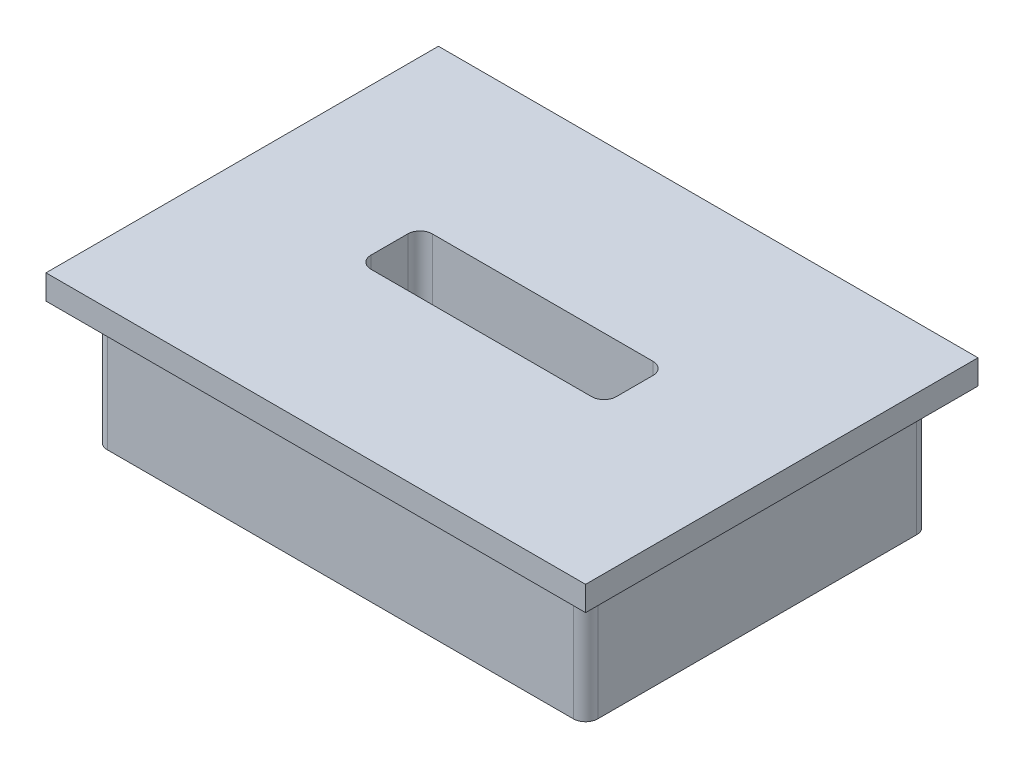
ISO-10303-21;
HEADER;
FILE_DESCRIPTION(('STEP AP214'),'2;1');
FILE_NAME('part.step','',(''),(''),'','','');
FILE_SCHEMA(('AUTOMOTIVE_DESIGN { 1 0 10303 214 1 1 1 1 }'));
ENDSEC;
DATA;
#1=APPLICATION_CONTEXT('core data for automotive mechanical design processes');
#2=APPLICATION_PROTOCOL_DEFINITION('international standard','automotive_design',2000,#1);
#3=PRODUCT_CONTEXT('',#1,'mechanical');
#4=PRODUCT('Part','Part','',(#3));
#5=PRODUCT_RELATED_PRODUCT_CATEGORY('part','',(#4));
#6=PRODUCT_DEFINITION_FORMATION('','',#4);
#7=PRODUCT_DEFINITION_CONTEXT('part definition',#1,'design');
#8=PRODUCT_DEFINITION('design','',#6,#7);
#9=PRODUCT_DEFINITION_SHAPE('','',#8);
#10=(LENGTH_UNIT() NAMED_UNIT(*) SI_UNIT(.MILLI.,.METRE.));
#11=(NAMED_UNIT(*) PLANE_ANGLE_UNIT() SI_UNIT($,.RADIAN.));
#12=(NAMED_UNIT(*) SI_UNIT($,.STERADIAN.) SOLID_ANGLE_UNIT());
#13=UNCERTAINTY_MEASURE_WITH_UNIT(LENGTH_MEASURE(1.E-05),#10,'distance_accuracy_value','');
#14=(GEOMETRIC_REPRESENTATION_CONTEXT(3) GLOBAL_UNCERTAINTY_ASSIGNED_CONTEXT((#13)) GLOBAL_UNIT_ASSIGNED_CONTEXT((#10,
#11,#12)) REPRESENTATION_CONTEXT('',''));
#15=CARTESIAN_POINT('',(0.,0.,0.));
#16=DIRECTION('',(0.,0.,1.));
#17=DIRECTION('',(1.,0.,0.));
#18=AXIS2_PLACEMENT_3D('',#15,#16,#17);
#19=CARTESIAN_POINT('',(0.,0.,0.));
#20=DIRECTION('',(0.,1.,0.));
#21=DIRECTION('',(0.,0.,1.));
#22=AXIS2_PLACEMENT_3D('',#19,#20,#21);
#23=PLANE('',#22);
#24=DIRECTION('',(-1.,0.,0.));
#25=VECTOR('',#24,1.);
#26=CARTESIAN_POINT('',(0.,0.,0.));
#27=LINE('',#26,#25);
#28=CARTESIAN_POINT('',(19.5,0.,0.));
#29=VERTEX_POINT('',#28);
#30=CARTESIAN_POINT('',(0.5,0.,0.));
#31=VERTEX_POINT('',#30);
#32=EDGE_CURVE('E239',#29,#31,#27,.T.);
#33=ORIENTED_EDGE('',*,*,#32,.F.);
#34=CARTESIAN_POINT('',(19.5,0.,0.5));
#35=DIRECTION('',(0.,1.,0.));
#36=DIRECTION('',(0.,0.,1.));
#37=AXIS2_PLACEMENT_3D('',#34,#35,#36);
#38=CIRCLE('',#37,0.5);
#39=CARTESIAN_POINT('',(20.,0.,0.5));
#40=VERTEX_POINT('',#39);
#41=EDGE_CURVE('E307',#29,#40,#38,.F.);
#42=ORIENTED_EDGE('',*,*,#41,.T.);
#43=DIRECTION('',(0.,0.,-1.));
#44=VECTOR('',#43,1.);
#45=CARTESIAN_POINT('',(20.,0.,0.));
#46=LINE('',#45,#44);
#47=CARTESIAN_POINT('',(20.,0.,13.5));
#48=VERTEX_POINT('',#47);
#49=EDGE_CURVE('E257',#48,#40,#46,.T.);
#50=ORIENTED_EDGE('',*,*,#49,.F.);
#51=CARTESIAN_POINT('',(19.5,0.,13.5));
#52=DIRECTION('',(0.,1.,0.));
#53=DIRECTION('',(0.,0.,1.));
#54=AXIS2_PLACEMENT_3D('',#51,#52,#53);
#55=CIRCLE('',#54,0.5);
#56=CARTESIAN_POINT('',(19.5,0.,14.));
#57=VERTEX_POINT('',#56);
#58=EDGE_CURVE('E298',#48,#57,#55,.F.);
#59=ORIENTED_EDGE('',*,*,#58,.T.);
#60=DIRECTION('',(1.,0.,0.));
#61=VECTOR('',#60,1.);
#62=CARTESIAN_POINT('',(0.,0.,14.));
#63=LINE('',#62,#61);
#64=CARTESIAN_POINT('',(0.500000000000002,0.,14.));
#65=VERTEX_POINT('',#64);
#66=EDGE_CURVE('E254',#65,#57,#63,.T.);
#67=ORIENTED_EDGE('',*,*,#66,.F.);
#68=CARTESIAN_POINT('',(0.500000000000002,0.,13.5));
#69=DIRECTION('',(0.,1.,0.));
#70=DIRECTION('',(0.,0.,1.));
#71=AXIS2_PLACEMENT_3D('',#68,#69,#70);
#72=CIRCLE('',#71,0.5);
#73=CARTESIAN_POINT('',(0.,0.,13.5));
#74=VERTEX_POINT('',#73);
#75=EDGE_CURVE('E301',#65,#74,#72,.F.);
#76=ORIENTED_EDGE('',*,*,#75,.T.);
#77=DIRECTION('',(0.,0.,1.));
#78=VECTOR('',#77,1.);
#79=CARTESIAN_POINT('',(0.,0.,0.));
#80=LINE('',#79,#78);
#81=CARTESIAN_POINT('',(0.,0.,0.5));
#82=VERTEX_POINT('',#81);
#83=EDGE_CURVE('E234',#82,#74,#80,.T.);
#84=ORIENTED_EDGE('',*,*,#83,.F.);
#85=CARTESIAN_POINT('',(0.5,0.,0.5));
#86=DIRECTION('',(0.,1.,0.));
#87=DIRECTION('',(0.,0.,1.));
#88=AXIS2_PLACEMENT_3D('',#85,#86,#87);
#89=CIRCLE('',#88,0.5);
#90=EDGE_CURVE('E304',#82,#31,#89,.F.);
#91=ORIENTED_EDGE('',*,*,#90,.T.);
#92=EDGE_LOOP('',(#33,#42,#50,#59,#67,#76,#84,#91));
#93=FACE_BOUND('',#92,.T.);
#94=DIRECTION('',(1.,0.,0.));
#95=VECTOR('',#94,1.);
#96=CARTESIAN_POINT('',(5.,0.,8.25));
#97=LINE('',#96,#95);
#98=CARTESIAN_POINT('',(5.5,0.,8.25));
#99=VERTEX_POINT('',#98);
#100=CARTESIAN_POINT('',(14.5,0.,8.25));
#101=VERTEX_POINT('',#100);
#102=EDGE_CURVE('E230',#99,#101,#97,.T.);
#103=ORIENTED_EDGE('',*,*,#102,.T.);
#104=CARTESIAN_POINT('',(14.5,0.,7.75));
#105=DIRECTION('',(0.,1.,0.));
#106=DIRECTION('',(0.,0.,1.));
#107=AXIS2_PLACEMENT_3D('',#104,#105,#106);
#108=CIRCLE('',#107,0.5);
#109=CARTESIAN_POINT('',(15.,0.,7.75));
#110=VERTEX_POINT('',#109);
#111=EDGE_CURVE('E348',#101,#110,#108,.T.);
#112=ORIENTED_EDGE('',*,*,#111,.T.);
#113=DIRECTION('',(0.,0.,-1.));
#114=VECTOR('',#113,1.);
#115=CARTESIAN_POINT('',(15.,0.,5.75));
#116=LINE('',#115,#114);
#117=CARTESIAN_POINT('',(15.,0.,6.25));
#118=VERTEX_POINT('',#117);
#119=EDGE_CURVE('E212',#110,#118,#116,.T.);
#120=ORIENTED_EDGE('',*,*,#119,.T.);
#121=CARTESIAN_POINT('',(14.5,0.,6.25));
#122=DIRECTION('',(0.,1.,0.));
#123=DIRECTION('',(0.,0.,1.));
#124=AXIS2_PLACEMENT_3D('',#121,#122,#123);
#125=CIRCLE('',#124,0.5);
#126=CARTESIAN_POINT('',(14.5,0.,5.75));
#127=VERTEX_POINT('',#126);
#128=EDGE_CURVE('E336',#118,#127,#125,.T.);
#129=ORIENTED_EDGE('',*,*,#128,.T.);
#130=DIRECTION('',(-1.,0.,0.));
#131=VECTOR('',#130,1.);
#132=CARTESIAN_POINT('',(5.,0.,5.75));
#133=LINE('',#132,#131);
#134=CARTESIAN_POINT('',(5.5,0.,5.75));
#135=VERTEX_POINT('',#134);
#136=EDGE_CURVE('E217',#127,#135,#133,.T.);
#137=ORIENTED_EDGE('',*,*,#136,.T.);
#138=CARTESIAN_POINT('',(5.5,0.,6.25));
#139=DIRECTION('',(0.,1.,0.));
#140=DIRECTION('',(0.,0.,1.));
#141=AXIS2_PLACEMENT_3D('',#138,#139,#140);
#142=CIRCLE('',#141,0.5);
#143=CARTESIAN_POINT('',(5.,0.,6.25));
#144=VERTEX_POINT('',#143);
#145=EDGE_CURVE('E330',#135,#144,#142,.T.);
#146=ORIENTED_EDGE('',*,*,#145,.T.);
#147=DIRECTION('',(0.,0.,1.));
#148=VECTOR('',#147,1.);
#149=CARTESIAN_POINT('',(5.,0.,5.75));
#150=LINE('',#149,#148);
#151=CARTESIAN_POINT('',(5.,0.,7.75));
#152=VERTEX_POINT('',#151);
#153=EDGE_CURVE('E226',#144,#152,#150,.T.);
#154=ORIENTED_EDGE('',*,*,#153,.T.);
#155=CARTESIAN_POINT('',(5.5,0.,7.75));
#156=DIRECTION('',(0.,1.,0.));
#157=DIRECTION('',(0.,0.,1.));
#158=AXIS2_PLACEMENT_3D('',#155,#156,#157);
#159=CIRCLE('',#158,0.5);
#160=EDGE_CURVE('E342',#152,#99,#159,.T.);
#161=ORIENTED_EDGE('',*,*,#160,.T.);
#162=EDGE_LOOP('',(#103,#112,#120,#129,#137,#146,#154,#161));
#163=FACE_BOUND('',#162,.T.);
#164=ADVANCED_FACE('F45',(#93,#163),#23,.F.);
#165=CARTESIAN_POINT('',(0.,5.,0.));
#166=DIRECTION('',(1.,0.,0.));
#167=DIRECTION('',(0.,0.,-1.));
#168=AXIS2_PLACEMENT_3D('',#165,#166,#167);
#169=PLANE('',#168);
#170=DIRECTION('',(0.,0.,1.));
#171=VECTOR('',#170,1.);
#172=CARTESIAN_POINT('',(0.,5.,0.));
#173=LINE('',#172,#171);
#174=CARTESIAN_POINT('',(0.,5.,0.5));
#175=VERTEX_POINT('',#174);
#176=CARTESIAN_POINT('',(0.,5.,13.5));
#177=VERTEX_POINT('',#176);
#178=EDGE_CURVE('E235',#175,#177,#173,.T.);
#179=ORIENTED_EDGE('',*,*,#178,.F.);
#180=DIRECTION('',(0.,-1.,0.));
#181=VECTOR('',#180,1.);
#182=CARTESIAN_POINT('',(0.,5.,0.5));
#183=LINE('',#182,#181);
#184=EDGE_CURVE('E320',#175,#82,#183,.T.);
#185=ORIENTED_EDGE('',*,*,#184,.T.);
#186=ORIENTED_EDGE('',*,*,#83,.T.);
#187=DIRECTION('',(0.,-1.,0.));
#188=VECTOR('',#187,1.);
#189=CARTESIAN_POINT('',(0.,5.,13.5));
#190=LINE('',#189,#188);
#191=EDGE_CURVE('E317',#74,#177,#190,.F.);
#192=ORIENTED_EDGE('',*,*,#191,.T.);
#193=EDGE_LOOP('',(#179,#185,#186,#192));
#194=FACE_BOUND('',#193,.T.);
#195=ADVANCED_FACE('F368',(#194),#169,.F.);
#196=CARTESIAN_POINT('',(0.,5.,14.));
#197=DIRECTION('',(0.,0.,-1.));
#198=DIRECTION('',(-1.,0.,0.));
#199=AXIS2_PLACEMENT_3D('',#196,#197,#198);
#200=PLANE('',#199);
#201=DIRECTION('',(1.,0.,0.));
#202=VECTOR('',#201,1.);
#203=CARTESIAN_POINT('',(0.,5.,14.));
#204=LINE('',#203,#202);
#205=CARTESIAN_POINT('',(0.500000000000002,5.,14.));
#206=VERTEX_POINT('',#205);
#207=CARTESIAN_POINT('',(19.5,5.,14.));
#208=VERTEX_POINT('',#207);
#209=EDGE_CURVE('E238',#206,#208,#204,.T.);
#210=ORIENTED_EDGE('',*,*,#209,.F.);
#211=DIRECTION('',(0.,-1.,0.));
#212=VECTOR('',#211,1.);
#213=CARTESIAN_POINT('',(0.500000000000002,5.,14.));
#214=LINE('',#213,#212);
#215=EDGE_CURVE('E326',#206,#65,#214,.T.);
#216=ORIENTED_EDGE('',*,*,#215,.T.);
#217=ORIENTED_EDGE('',*,*,#66,.T.);
#218=DIRECTION('',(0.,-1.,0.));
#219=VECTOR('',#218,1.);
#220=CARTESIAN_POINT('',(19.5,5.,14.));
#221=LINE('',#220,#219);
#222=EDGE_CURVE('E61',#57,#208,#221,.F.);
#223=ORIENTED_EDGE('',*,*,#222,.T.);
#224=EDGE_LOOP('',(#210,#216,#217,#223));
#225=FACE_BOUND('',#224,.T.);
#226=ADVANCED_FACE('F390',(#225),#200,.F.);
#227=CARTESIAN_POINT('',(20.,5.,0.));
#228=DIRECTION('',(-1.,0.,0.));
#229=DIRECTION('',(0.,0.,1.));
#230=AXIS2_PLACEMENT_3D('',#227,#228,#229);
#231=PLANE('',#230);
#232=ORIENTED_EDGE('',*,*,#49,.T.);
#233=DIRECTION('',(0.,-1.,0.));
#234=VECTOR('',#233,1.);
#235=CARTESIAN_POINT('',(20.,5.,0.5));
#236=LINE('',#235,#234);
#237=CARTESIAN_POINT('',(20.,5.,0.5));
#238=VERTEX_POINT('',#237);
#239=EDGE_CURVE('E314',#40,#238,#236,.F.);
#240=ORIENTED_EDGE('',*,*,#239,.T.);
#241=DIRECTION('',(0.,0.,-1.));
#242=VECTOR('',#241,1.);
#243=CARTESIAN_POINT('',(20.,5.,0.));
#244=LINE('',#243,#242);
#245=CARTESIAN_POINT('',(20.,5.,13.5));
#246=VERTEX_POINT('',#245);
#247=EDGE_CURVE('E242',#246,#238,#244,.T.);
#248=ORIENTED_EDGE('',*,*,#247,.F.);
#249=DIRECTION('',(0.,-1.,0.));
#250=VECTOR('',#249,1.);
#251=CARTESIAN_POINT('',(20.,5.,13.5));
#252=LINE('',#251,#250);
#253=EDGE_CURVE('E310',#246,#48,#252,.T.);
#254=ORIENTED_EDGE('',*,*,#253,.T.);
#255=EDGE_LOOP('',(#232,#240,#248,#254));
#256=FACE_BOUND('',#255,.T.);
#257=ADVANCED_FACE('F384',(#256),#231,.F.);
#258=CARTESIAN_POINT('',(0.,5.,0.));
#259=DIRECTION('',(0.,0.,1.));
#260=DIRECTION('',(1.,0.,0.));
#261=AXIS2_PLACEMENT_3D('',#258,#259,#260);
#262=PLANE('',#261);
#263=DIRECTION('',(-1.,0.,0.));
#264=VECTOR('',#263,1.);
#265=CARTESIAN_POINT('',(0.,5.,0.));
#266=LINE('',#265,#264);
#267=CARTESIAN_POINT('',(19.5,5.,0.));
#268=VERTEX_POINT('',#267);
#269=CARTESIAN_POINT('',(0.5,5.,0.));
#270=VERTEX_POINT('',#269);
#271=EDGE_CURVE('E246',#268,#270,#266,.T.);
#272=ORIENTED_EDGE('',*,*,#271,.F.);
#273=DIRECTION('',(0.,-1.,0.));
#274=VECTOR('',#273,1.);
#275=CARTESIAN_POINT('',(19.5,5.,0.));
#276=LINE('',#275,#274);
#277=EDGE_CURVE('E294',#268,#29,#276,.T.);
#278=ORIENTED_EDGE('',*,*,#277,.T.);
#279=ORIENTED_EDGE('',*,*,#32,.T.);
#280=DIRECTION('',(0.,-1.,0.));
#281=VECTOR('',#280,1.);
#282=CARTESIAN_POINT('',(0.5,5.,0.));
#283=LINE('',#282,#281);
#284=EDGE_CURVE('E291',#31,#270,#283,.F.);
#285=ORIENTED_EDGE('',*,*,#284,.T.);
#286=EDGE_LOOP('',(#272,#278,#279,#285));
#287=FACE_BOUND('',#286,.T.);
#288=ADVANCED_FACE('F376',(#287),#262,.F.);
#289=CARTESIAN_POINT('',(15.,5.,5.75));
#290=DIRECTION('',(-1.,0.,0.));
#291=DIRECTION('',(0.,0.,1.));
#292=AXIS2_PLACEMENT_3D('',#289,#290,#291);
#293=PLANE('',#292);
#294=DIRECTION('',(0.,0.,-1.));
#295=VECTOR('',#294,1.);
#296=CARTESIAN_POINT('',(15.,6.,5.75));
#297=LINE('',#296,#295);
#298=CARTESIAN_POINT('',(15.,6.,7.75));
#299=VERTEX_POINT('',#298);
#300=CARTESIAN_POINT('',(15.,6.,6.25));
#301=VERTEX_POINT('',#300);
#302=EDGE_CURVE('E607',#299,#301,#297,.T.);
#303=ORIENTED_EDGE('',*,*,#302,.T.);
#304=DIRECTION('',(0.,-1.,0.));
#305=VECTOR('',#304,1.);
#306=CARTESIAN_POINT('',(15.,0.,6.25));
#307=LINE('',#306,#305);
#308=EDGE_CURVE('E280',#301,#118,#307,.T.);
#309=ORIENTED_EDGE('',*,*,#308,.T.);
#310=ORIENTED_EDGE('',*,*,#119,.F.);
#311=DIRECTION('',(0.,-1.,0.));
#312=VECTOR('',#311,1.);
#313=CARTESIAN_POINT('',(15.,6.,7.75));
#314=LINE('',#313,#312);
#315=EDGE_CURVE('E277',#110,#299,#314,.F.);
#316=ORIENTED_EDGE('',*,*,#315,.T.);
#317=EDGE_LOOP('',(#303,#309,#310,#316));
#318=FACE_BOUND('',#317,.T.);
#319=ADVANCED_FACE('F409',(#318),#293,.T.);
#320=CARTESIAN_POINT('',(5.,5.,5.75));
#321=DIRECTION('',(0.,0.,1.));
#322=DIRECTION('',(1.,0.,0.));
#323=AXIS2_PLACEMENT_3D('',#320,#321,#322);
#324=PLANE('',#323);
#325=DIRECTION('',(-1.,0.,0.));
#326=VECTOR('',#325,1.);
#327=CARTESIAN_POINT('',(5.,6.,5.75));
#328=LINE('',#327,#326);
#329=CARTESIAN_POINT('',(14.5,6.,5.75));
#330=VERTEX_POINT('',#329);
#331=CARTESIAN_POINT('',(5.5,6.,5.75));
#332=VERTEX_POINT('',#331);
#333=EDGE_CURVE('E613',#330,#332,#328,.T.);
#334=ORIENTED_EDGE('',*,*,#333,.T.);
#335=DIRECTION('',(0.,-1.,0.));
#336=VECTOR('',#335,1.);
#337=CARTESIAN_POINT('',(5.5,0.,5.75));
#338=LINE('',#337,#336);
#339=EDGE_CURVE('E266',#332,#135,#338,.T.);
#340=ORIENTED_EDGE('',*,*,#339,.T.);
#341=ORIENTED_EDGE('',*,*,#136,.F.);
#342=DIRECTION('',(0.,-1.,0.));
#343=VECTOR('',#342,1.);
#344=CARTESIAN_POINT('',(14.5,6.,5.75));
#345=LINE('',#344,#343);
#346=EDGE_CURVE('E250',#127,#330,#345,.F.);
#347=ORIENTED_EDGE('',*,*,#346,.T.);
#348=EDGE_LOOP('',(#334,#340,#341,#347));
#349=FACE_BOUND('',#348,.T.);
#350=ADVANCED_FACE('F540',(#349),#324,.T.);
#351=CARTESIAN_POINT('',(5.,5.,5.75));
#352=DIRECTION('',(1.,0.,0.));
#353=DIRECTION('',(0.,0.,-1.));
#354=AXIS2_PLACEMENT_3D('',#351,#352,#353);
#355=PLANE('',#354);
#356=ORIENTED_EDGE('',*,*,#153,.F.);
#357=DIRECTION('',(0.,-1.,0.));
#358=VECTOR('',#357,1.);
#359=CARTESIAN_POINT('',(5.,6.,6.25));
#360=LINE('',#359,#358);
#361=CARTESIAN_POINT('',(5.,6.,6.25));
#362=VERTEX_POINT('',#361);
#363=EDGE_CURVE('E274',#144,#362,#360,.F.);
#364=ORIENTED_EDGE('',*,*,#363,.T.);
#365=DIRECTION('',(0.,0.,1.));
#366=VECTOR('',#365,1.);
#367=CARTESIAN_POINT('',(5.,6.,5.75));
#368=LINE('',#367,#366);
#369=CARTESIAN_POINT('',(5.,6.,7.75));
#370=VERTEX_POINT('',#369);
#371=EDGE_CURVE('E628',#362,#370,#368,.T.);
#372=ORIENTED_EDGE('',*,*,#371,.T.);
#373=DIRECTION('',(0.,-1.,0.));
#374=VECTOR('',#373,1.);
#375=CARTESIAN_POINT('',(5.,0.,7.75));
#376=LINE('',#375,#374);
#377=EDGE_CURVE('E270',#370,#152,#376,.T.);
#378=ORIENTED_EDGE('',*,*,#377,.T.);
#379=EDGE_LOOP('',(#356,#364,#372,#378));
#380=FACE_BOUND('',#379,.T.);
#381=ADVANCED_FACE('F530',(#380),#355,.T.);
#382=CARTESIAN_POINT('',(5.,5.,8.25));
#383=DIRECTION('',(0.,0.,-1.));
#384=DIRECTION('',(-1.,0.,0.));
#385=AXIS2_PLACEMENT_3D('',#382,#383,#384);
#386=PLANE('',#385);
#387=ORIENTED_EDGE('',*,*,#102,.F.);
#388=DIRECTION('',(0.,-1.,0.));
#389=VECTOR('',#388,1.);
#390=CARTESIAN_POINT('',(5.5,6.,8.25));
#391=LINE('',#390,#389);
#392=CARTESIAN_POINT('',(5.5,6.,8.25));
#393=VERTEX_POINT('',#392);
#394=EDGE_CURVE('E288',#99,#393,#391,.F.);
#395=ORIENTED_EDGE('',*,*,#394,.T.);
#396=DIRECTION('',(1.,0.,0.));
#397=VECTOR('',#396,1.);
#398=CARTESIAN_POINT('',(5.,6.,8.25));
#399=LINE('',#398,#397);
#400=CARTESIAN_POINT('',(14.5,6.,8.25));
#401=VERTEX_POINT('',#400);
#402=EDGE_CURVE('E614',#393,#401,#399,.T.);
#403=ORIENTED_EDGE('',*,*,#402,.T.);
#404=DIRECTION('',(0.,-1.,0.));
#405=VECTOR('',#404,1.);
#406=CARTESIAN_POINT('',(14.5,0.,8.25));
#407=LINE('',#406,#405);
#408=EDGE_CURVE('E284',#401,#101,#407,.T.);
#409=ORIENTED_EDGE('',*,*,#408,.T.);
#410=EDGE_LOOP('',(#387,#395,#403,#409));
#411=FACE_BOUND('',#410,.T.);
#412=ADVANCED_FACE('F520',(#411),#386,.T.);
#413=CARTESIAN_POINT('',(0.,5.,0.));
#414=DIRECTION('',(0.,1.,0.));
#415=DIRECTION('',(0.,0.,1.));
#416=AXIS2_PLACEMENT_3D('',#413,#414,#415);
#417=PLANE('',#416);
#418=DIRECTION('',(0.,0.,1.));
#419=VECTOR('',#418,1.);
#420=CARTESIAN_POINT('',(-1.,5.,-1.));
#421=LINE('',#420,#419);
#422=CARTESIAN_POINT('',(-1.,5.,-1.));
#423=VERTEX_POINT('',#422);
#424=CARTESIAN_POINT('',(-0.999999999999998,5.,15.));
#425=VERTEX_POINT('',#424);
#426=EDGE_CURVE('E210',#423,#425,#421,.T.);
#427=ORIENTED_EDGE('',*,*,#426,.F.);
#428=DIRECTION('',(-1.,0.,0.));
#429=VECTOR('',#428,1.);
#430=CARTESIAN_POINT('',(-1.,5.,-1.));
#431=LINE('',#430,#429);
#432=CARTESIAN_POINT('',(21.,5.,-1.));
#433=VERTEX_POINT('',#432);
#434=EDGE_CURVE('E206',#433,#423,#431,.T.);
#435=ORIENTED_EDGE('',*,*,#434,.F.);
#436=DIRECTION('',(0.,0.,-1.));
#437=VECTOR('',#436,1.);
#438=CARTESIAN_POINT('',(21.,5.,-1.));
#439=LINE('',#438,#437);
#440=CARTESIAN_POINT('',(21.,5.,15.));
#441=VERTEX_POINT('',#440);
#442=EDGE_CURVE('E652',#441,#433,#439,.T.);
#443=ORIENTED_EDGE('',*,*,#442,.F.);
#444=DIRECTION('',(1.,0.,0.));
#445=VECTOR('',#444,1.);
#446=CARTESIAN_POINT('',(-0.999999999999998,5.,15.));
#447=LINE('',#446,#445);
#448=EDGE_CURVE('E649',#425,#441,#447,.T.);
#449=ORIENTED_EDGE('',*,*,#448,.F.);
#450=EDGE_LOOP('',(#427,#435,#443,#449));
#451=FACE_BOUND('',#450,.T.);
#452=ORIENTED_EDGE('',*,*,#247,.T.);
#453=CARTESIAN_POINT('',(19.5,5.,0.5));
#454=DIRECTION('',(0.,1.,0.));
#455=DIRECTION('',(0.,0.,1.));
#456=AXIS2_PLACEMENT_3D('',#453,#454,#455);
#457=CIRCLE('',#456,0.5);
#458=EDGE_CURVE('E354',#238,#268,#457,.T.);
#459=ORIENTED_EDGE('',*,*,#458,.T.);
#460=ORIENTED_EDGE('',*,*,#271,.T.);
#461=CARTESIAN_POINT('',(0.5,5.,0.5));
#462=DIRECTION('',(0.,1.,0.));
#463=DIRECTION('',(0.,0.,1.));
#464=AXIS2_PLACEMENT_3D('',#461,#462,#463);
#465=CIRCLE('',#464,0.5);
#466=EDGE_CURVE('E357',#270,#175,#465,.T.);
#467=ORIENTED_EDGE('',*,*,#466,.T.);
#468=ORIENTED_EDGE('',*,*,#178,.T.);
#469=CARTESIAN_POINT('',(0.500000000000002,5.,13.5));
#470=DIRECTION('',(0.,1.,0.));
#471=DIRECTION('',(0.,0.,1.));
#472=AXIS2_PLACEMENT_3D('',#469,#470,#471);
#473=CIRCLE('',#472,0.5);
#474=EDGE_CURVE('E54',#177,#206,#473,.T.);
#475=ORIENTED_EDGE('',*,*,#474,.T.);
#476=ORIENTED_EDGE('',*,*,#209,.T.);
#477=CARTESIAN_POINT('',(19.5,5.,13.5));
#478=DIRECTION('',(0.,1.,0.));
#479=DIRECTION('',(0.,0.,1.));
#480=AXIS2_PLACEMENT_3D('',#477,#478,#479);
#481=CIRCLE('',#480,0.5);
#482=EDGE_CURVE('E11',#208,#246,#481,.T.);
#483=ORIENTED_EDGE('',*,*,#482,.T.);
#484=EDGE_LOOP('',(#452,#459,#460,#467,#468,#475,#476,#483));
#485=FACE_BOUND('',#484,.T.);
#486=ADVANCED_FACE('F362',(#451,#485),#417,.F.);
#487=CARTESIAN_POINT('',(0.,6.,0.));
#488=DIRECTION('',(0.,1.,0.));
#489=DIRECTION('',(0.,0.,1.));
#490=AXIS2_PLACEMENT_3D('',#487,#488,#489);
#491=PLANE('',#490);
#492=DIRECTION('',(0.,0.,1.));
#493=VECTOR('',#492,1.);
#494=CARTESIAN_POINT('',(-1.,6.,-1.));
#495=LINE('',#494,#493);
#496=CARTESIAN_POINT('',(-1.,6.,-1.));
#497=VERTEX_POINT('',#496);
#498=CARTESIAN_POINT('',(-0.999999999999998,6.,15.));
#499=VERTEX_POINT('',#498);
#500=EDGE_CURVE('E195',#497,#499,#495,.T.);
#501=ORIENTED_EDGE('',*,*,#500,.T.);
#502=DIRECTION('',(1.,0.,0.));
#503=VECTOR('',#502,1.);
#504=CARTESIAN_POINT('',(-0.999999999999998,6.,15.));
#505=LINE('',#504,#503);
#506=CARTESIAN_POINT('',(21.,6.,15.));
#507=VERTEX_POINT('',#506);
#508=EDGE_CURVE('E183',#499,#507,#505,.T.);
#509=ORIENTED_EDGE('',*,*,#508,.T.);
#510=DIRECTION('',(0.,0.,-1.));
#511=VECTOR('',#510,1.);
#512=CARTESIAN_POINT('',(21.,6.,-1.));
#513=LINE('',#512,#511);
#514=CARTESIAN_POINT('',(21.,6.,-1.));
#515=VERTEX_POINT('',#514);
#516=EDGE_CURVE('E194',#507,#515,#513,.T.);
#517=ORIENTED_EDGE('',*,*,#516,.T.);
#518=DIRECTION('',(-1.,0.,0.));
#519=VECTOR('',#518,1.);
#520=CARTESIAN_POINT('',(-1.,6.,-1.));
#521=LINE('',#520,#519);
#522=EDGE_CURVE('E201',#515,#497,#521,.T.);
#523=ORIENTED_EDGE('',*,*,#522,.T.);
#524=EDGE_LOOP('',(#501,#509,#517,#523));
#525=FACE_BOUND('',#524,.T.);
#526=ORIENTED_EDGE('',*,*,#402,.F.);
#527=CARTESIAN_POINT('',(5.5,6.,7.75));
#528=DIRECTION('',(0.,1.,0.));
#529=DIRECTION('',(0.,0.,1.));
#530=AXIS2_PLACEMENT_3D('',#527,#528,#529);
#531=CIRCLE('',#530,0.5);
#532=EDGE_CURVE('E345',#393,#370,#531,.F.);
#533=ORIENTED_EDGE('',*,*,#532,.T.);
#534=ORIENTED_EDGE('',*,*,#371,.F.);
#535=CARTESIAN_POINT('',(5.5,6.,6.25));
#536=DIRECTION('',(0.,1.,0.));
#537=DIRECTION('',(0.,0.,1.));
#538=AXIS2_PLACEMENT_3D('',#535,#536,#537);
#539=CIRCLE('',#538,0.5);
#540=EDGE_CURVE('E333',#362,#332,#539,.F.);
#541=ORIENTED_EDGE('',*,*,#540,.T.);
#542=ORIENTED_EDGE('',*,*,#333,.F.);
#543=CARTESIAN_POINT('',(14.5,6.,6.25));
#544=DIRECTION('',(0.,1.,0.));
#545=DIRECTION('',(0.,0.,1.));
#546=AXIS2_PLACEMENT_3D('',#543,#544,#545);
#547=CIRCLE('',#546,0.5);
#548=EDGE_CURVE('E339',#330,#301,#547,.F.);
#549=ORIENTED_EDGE('',*,*,#548,.T.);
#550=ORIENTED_EDGE('',*,*,#302,.F.);
#551=CARTESIAN_POINT('',(14.5,6.,7.75));
#552=DIRECTION('',(0.,1.,0.));
#553=DIRECTION('',(0.,0.,1.));
#554=AXIS2_PLACEMENT_3D('',#551,#552,#553);
#555=CIRCLE('',#554,0.5);
#556=EDGE_CURVE('E351',#299,#401,#555,.F.);
#557=ORIENTED_EDGE('',*,*,#556,.T.);
#558=EDGE_LOOP('',(#526,#533,#534,#541,#542,#549,#550,#557));
#559=FACE_BOUND('',#558,.T.);
#560=ADVANCED_FACE('F198',(#525,#559),#491,.T.);
#561=CARTESIAN_POINT('',(-1.,6.,-1.));
#562=DIRECTION('',(1.,0.,0.));
#563=DIRECTION('',(0.,0.,-1.));
#564=AXIS2_PLACEMENT_3D('',#561,#562,#563);
#565=PLANE('',#564);
#566=ORIENTED_EDGE('',*,*,#426,.T.);
#567=DIRECTION('',(0.,-1.,0.));
#568=VECTOR('',#567,1.);
#569=CARTESIAN_POINT('',(-0.999999999999998,6.,15.));
#570=LINE('',#569,#568);
#571=EDGE_CURVE('E187',#499,#425,#570,.T.);
#572=ORIENTED_EDGE('',*,*,#571,.F.);
#573=ORIENTED_EDGE('',*,*,#500,.F.);
#574=DIRECTION('',(0.,-1.,0.));
#575=VECTOR('',#574,1.);
#576=CARTESIAN_POINT('',(-1.,6.,-1.));
#577=LINE('',#576,#575);
#578=EDGE_CURVE('E646',#497,#423,#577,.T.);
#579=ORIENTED_EDGE('',*,*,#578,.T.);
#580=EDGE_LOOP('',(#566,#572,#573,#579));
#581=FACE_BOUND('',#580,.T.);
#582=ADVANCED_FACE('F208',(#581),#565,.F.);
#583=CARTESIAN_POINT('',(-0.999999999999998,6.,15.));
#584=DIRECTION('',(0.,0.,-1.));
#585=DIRECTION('',(-1.,0.,0.));
#586=AXIS2_PLACEMENT_3D('',#583,#584,#585);
#587=PLANE('',#586);
#588=ORIENTED_EDGE('',*,*,#448,.T.);
#589=DIRECTION('',(0.,-1.,0.));
#590=VECTOR('',#589,1.);
#591=CARTESIAN_POINT('',(21.,6.,15.));
#592=LINE('',#591,#590);
#593=EDGE_CURVE('E190',#507,#441,#592,.T.);
#594=ORIENTED_EDGE('',*,*,#593,.F.);
#595=ORIENTED_EDGE('',*,*,#508,.F.);
#596=ORIENTED_EDGE('',*,*,#571,.T.);
#597=EDGE_LOOP('',(#588,#594,#595,#596));
#598=FACE_BOUND('',#597,.T.);
#599=ADVANCED_FACE('F185',(#598),#587,.F.);
#600=CARTESIAN_POINT('',(21.,6.,-1.));
#601=DIRECTION('',(-1.,0.,0.));
#602=DIRECTION('',(0.,0.,1.));
#603=AXIS2_PLACEMENT_3D('',#600,#601,#602);
#604=PLANE('',#603);
#605=ORIENTED_EDGE('',*,*,#442,.T.);
#606=DIRECTION('',(0.,-1.,0.));
#607=VECTOR('',#606,1.);
#608=CARTESIAN_POINT('',(21.,6.,-1.));
#609=LINE('',#608,#607);
#610=EDGE_CURVE('E219',#515,#433,#609,.T.);
#611=ORIENTED_EDGE('',*,*,#610,.F.);
#612=ORIENTED_EDGE('',*,*,#516,.F.);
#613=ORIENTED_EDGE('',*,*,#593,.T.);
#614=EDGE_LOOP('',(#605,#611,#612,#613));
#615=FACE_BOUND('',#614,.T.);
#616=ADVANCED_FACE('F482',(#615),#604,.F.);
#617=CARTESIAN_POINT('',(-1.,6.,-1.));
#618=DIRECTION('',(0.,0.,1.));
#619=DIRECTION('',(1.,0.,0.));
#620=AXIS2_PLACEMENT_3D('',#617,#618,#619);
#621=PLANE('',#620);
#622=ORIENTED_EDGE('',*,*,#434,.T.);
#623=ORIENTED_EDGE('',*,*,#578,.F.);
#624=ORIENTED_EDGE('',*,*,#522,.F.);
#625=ORIENTED_EDGE('',*,*,#610,.T.);
#626=EDGE_LOOP('',(#622,#623,#624,#625));
#627=FACE_BOUND('',#626,.T.);
#628=ADVANCED_FACE('F421',(#627),#621,.F.);
#629=CARTESIAN_POINT('',(5.5,5.,6.25));
#630=DIRECTION('',(0.,1.,0.));
#631=DIRECTION('',(0.,0.,1.));
#632=AXIS2_PLACEMENT_3D('',#629,#630,#631);
#633=CYLINDRICAL_SURFACE('',#632,0.5);
#634=ORIENTED_EDGE('',*,*,#540,.F.);
#635=ORIENTED_EDGE('',*,*,#363,.F.);
#636=ORIENTED_EDGE('',*,*,#145,.F.);
#637=ORIENTED_EDGE('',*,*,#339,.F.);
#638=EDGE_LOOP('',(#634,#635,#636,#637));
#639=FACE_BOUND('',#638,.T.);
#640=ADVANCED_FACE('F417',(#639),#633,.F.);
#641=CARTESIAN_POINT('',(14.5,5.,6.25));
#642=DIRECTION('',(0.,1.,0.));
#643=DIRECTION('',(0.,0.,1.));
#644=AXIS2_PLACEMENT_3D('',#641,#642,#643);
#645=CYLINDRICAL_SURFACE('',#644,0.5);
#646=ORIENTED_EDGE('',*,*,#548,.F.);
#647=ORIENTED_EDGE('',*,*,#346,.F.);
#648=ORIENTED_EDGE('',*,*,#128,.F.);
#649=ORIENTED_EDGE('',*,*,#308,.F.);
#650=EDGE_LOOP('',(#646,#647,#648,#649));
#651=FACE_BOUND('',#650,.T.);
#652=ADVANCED_FACE('F420',(#651),#645,.F.);
#653=CARTESIAN_POINT('',(5.5,5.,7.75));
#654=DIRECTION('',(0.,1.,0.));
#655=DIRECTION('',(0.,0.,1.));
#656=AXIS2_PLACEMENT_3D('',#653,#654,#655);
#657=CYLINDRICAL_SURFACE('',#656,0.5);
#658=ORIENTED_EDGE('',*,*,#532,.F.);
#659=ORIENTED_EDGE('',*,*,#394,.F.);
#660=ORIENTED_EDGE('',*,*,#160,.F.);
#661=ORIENTED_EDGE('',*,*,#377,.F.);
#662=EDGE_LOOP('',(#658,#659,#660,#661));
#663=FACE_BOUND('',#662,.T.);
#664=ADVANCED_FACE('F425',(#663),#657,.F.);
#665=CARTESIAN_POINT('',(14.5,5.,7.75));
#666=DIRECTION('',(0.,1.,0.));
#667=DIRECTION('',(0.,0.,1.));
#668=AXIS2_PLACEMENT_3D('',#665,#666,#667);
#669=CYLINDRICAL_SURFACE('',#668,0.5);
#670=ORIENTED_EDGE('',*,*,#556,.F.);
#671=ORIENTED_EDGE('',*,*,#315,.F.);
#672=ORIENTED_EDGE('',*,*,#111,.F.);
#673=ORIENTED_EDGE('',*,*,#408,.F.);
#674=EDGE_LOOP('',(#670,#671,#672,#673));
#675=FACE_BOUND('',#674,.T.);
#676=ADVANCED_FACE('F429',(#675),#669,.F.);
#677=CARTESIAN_POINT('',(19.5,5.,0.5));
#678=DIRECTION('',(0.,-1.,0.));
#679=DIRECTION('',(0.,0.,-1.));
#680=AXIS2_PLACEMENT_3D('',#677,#678,#679);
#681=CYLINDRICAL_SURFACE('',#680,0.5);
#682=ORIENTED_EDGE('',*,*,#458,.F.);
#683=ORIENTED_EDGE('',*,*,#239,.F.);
#684=ORIENTED_EDGE('',*,*,#41,.F.);
#685=ORIENTED_EDGE('',*,*,#277,.F.);
#686=EDGE_LOOP('',(#682,#683,#684,#685));
#687=FACE_BOUND('',#686,.T.);
#688=ADVANCED_FACE('F380',(#687),#681,.T.);
#689=CARTESIAN_POINT('',(0.5,5.,0.5));
#690=DIRECTION('',(0.,-1.,0.));
#691=DIRECTION('',(0.,0.,-1.));
#692=AXIS2_PLACEMENT_3D('',#689,#690,#691);
#693=CYLINDRICAL_SURFACE('',#692,0.5);
#694=ORIENTED_EDGE('',*,*,#466,.F.);
#695=ORIENTED_EDGE('',*,*,#284,.F.);
#696=ORIENTED_EDGE('',*,*,#90,.F.);
#697=ORIENTED_EDGE('',*,*,#184,.F.);
#698=EDGE_LOOP('',(#694,#695,#696,#697));
#699=FACE_BOUND('',#698,.T.);
#700=ADVANCED_FACE('F371',(#699),#693,.T.);
#701=CARTESIAN_POINT('',(0.500000000000002,5.,13.5));
#702=DIRECTION('',(0.,-1.,0.));
#703=DIRECTION('',(0.,0.,-1.));
#704=AXIS2_PLACEMENT_3D('',#701,#702,#703);
#705=CYLINDRICAL_SURFACE('',#704,0.5);
#706=ORIENTED_EDGE('',*,*,#474,.F.);
#707=ORIENTED_EDGE('',*,*,#191,.F.);
#708=ORIENTED_EDGE('',*,*,#75,.F.);
#709=ORIENTED_EDGE('',*,*,#215,.F.);
#710=EDGE_LOOP('',(#706,#707,#708,#709));
#711=FACE_BOUND('',#710,.T.);
#712=ADVANCED_FACE('F393',(#711),#705,.T.);
#713=CARTESIAN_POINT('',(19.5,5.,13.5));
#714=DIRECTION('',(0.,-1.,0.));
#715=DIRECTION('',(0.,0.,-1.));
#716=AXIS2_PLACEMENT_3D('',#713,#714,#715);
#717=CYLINDRICAL_SURFACE('',#716,0.5);
#718=ORIENTED_EDGE('',*,*,#482,.F.);
#719=ORIENTED_EDGE('',*,*,#222,.F.);
#720=ORIENTED_EDGE('',*,*,#58,.F.);
#721=ORIENTED_EDGE('',*,*,#253,.F.);
#722=EDGE_LOOP('',(#718,#719,#720,#721));
#723=FACE_BOUND('',#722,.T.);
#724=ADVANCED_FACE('F47',(#723),#717,.T.);
#725=CLOSED_SHELL('',(#164,#195,#226,#257,#288,#319,#350,#381,#412,#486,#560,#582,#599,#616,
#628,#640,#652,#664,#676,#688,#700,#712,#724));
#726=MANIFOLD_SOLID_BREP('B2',#725);
#727=ADVANCED_BREP_SHAPE_REPRESENTATION('',(#18,#726),#14);
#728=SHAPE_DEFINITION_REPRESENTATION(#9,#727);
ENDSEC;
END-ISO-10303-21;
